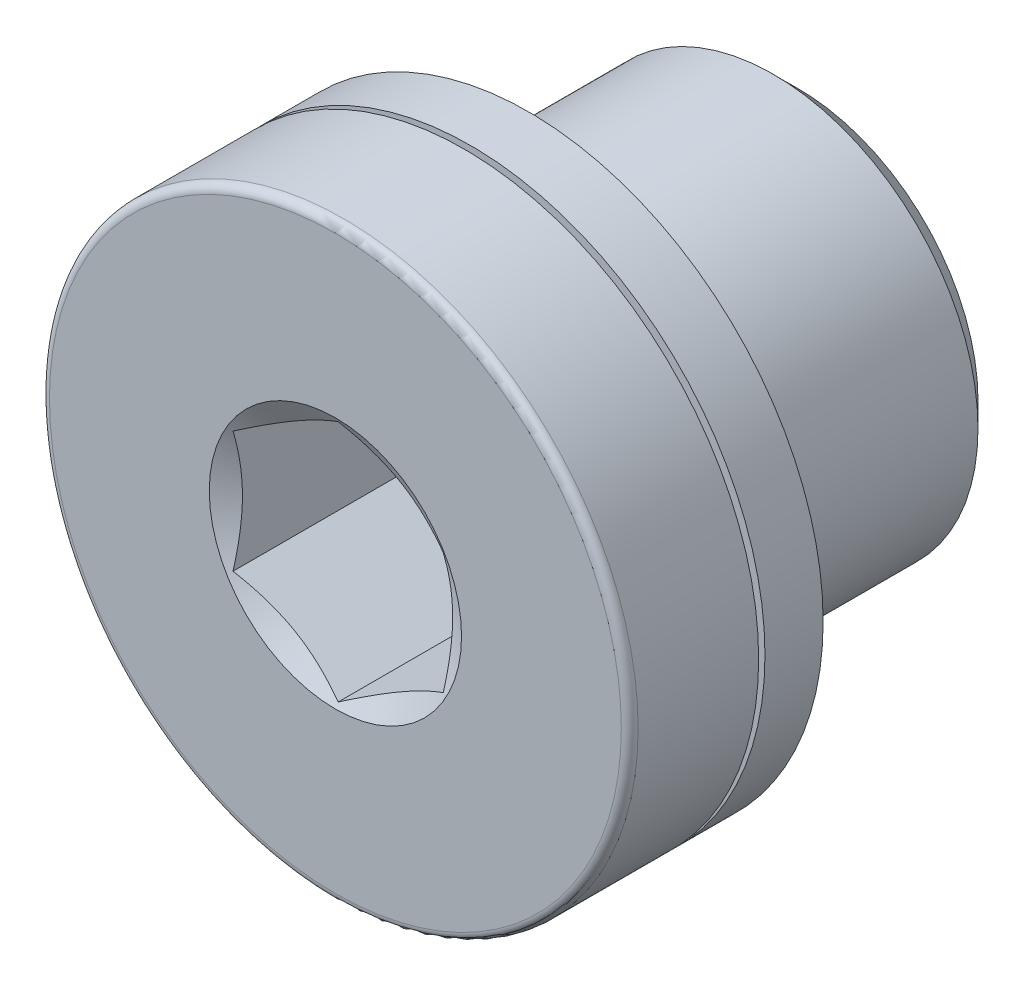
ISO-10303-21;
HEADER;
FILE_DESCRIPTION(('STEP AP214'),'2;1');
FILE_NAME('part.step','',(''),(''),'','','');
FILE_SCHEMA(('AUTOMOTIVE_DESIGN { 1 0 10303 214 1 1 1 1 }'));
ENDSEC;
DATA;
#1=APPLICATION_CONTEXT('core data for automotive mechanical design processes');
#2=APPLICATION_PROTOCOL_DEFINITION('international standard','automotive_design',2000,#1);
#3=PRODUCT_CONTEXT('',#1,'mechanical');
#4=PRODUCT('Part','Part','',(#3));
#5=PRODUCT_RELATED_PRODUCT_CATEGORY('part','',(#4));
#6=PRODUCT_DEFINITION_FORMATION('','',#4);
#7=PRODUCT_DEFINITION_CONTEXT('part definition',#1,'design');
#8=PRODUCT_DEFINITION('design','',#6,#7);
#9=PRODUCT_DEFINITION_SHAPE('','',#8);
#10=(LENGTH_UNIT() NAMED_UNIT(*) SI_UNIT(.MILLI.,.METRE.));
#11=(NAMED_UNIT(*) PLANE_ANGLE_UNIT() SI_UNIT($,.RADIAN.));
#12=(NAMED_UNIT(*) SI_UNIT($,.STERADIAN.) SOLID_ANGLE_UNIT());
#13=UNCERTAINTY_MEASURE_WITH_UNIT(LENGTH_MEASURE(1.E-05),#10,'distance_accuracy_value','');
#14=(GEOMETRIC_REPRESENTATION_CONTEXT(3) GLOBAL_UNCERTAINTY_ASSIGNED_CONTEXT((#13)) GLOBAL_UNIT_ASSIGNED_CONTEXT((#10,
#11,#12)) REPRESENTATION_CONTEXT('',''));
#15=CARTESIAN_POINT('',(0.,0.,0.));
#16=DIRECTION('',(0.,0.,1.));
#17=DIRECTION('',(1.,0.,0.));
#18=AXIS2_PLACEMENT_3D('',#15,#16,#17);
#19=CARTESIAN_POINT('',(0.,0.,4.6));
#20=DIRECTION('',(0.,0.,1.));
#21=DIRECTION('',(1.,0.,0.));
#22=AXIS2_PLACEMENT_3D('',#19,#20,#21);
#23=CONICAL_SURFACE('',#22,3.,1.04719755119659);
#24=CARTESIAN_POINT('',(0.0002,-2.88686681600194,4.53468252976428));
#25=CARTESIAN_POINT('',(-0.109663234734872,-2.82343724785372,4.4980464855128));
#26=CARTESIAN_POINT('',(-0.220474799896527,-2.75946016087832,4.46472708437023));
#27=CARTESIAN_POINT('',(-0.444016833466053,-2.63039810762176,4.40656715096303));
#28=CARTESIAN_POINT('',(-0.556751274528392,-2.56531084772748,4.38174719455291));
#29=CARTESIAN_POINT('',(-0.780822993875274,-2.43594298024478,4.34311051684623));
#30=CARTESIAN_POINT('',(-0.892125791767382,-2.37168227992022,4.32903666159082));
#31=CARTESIAN_POINT('',(-1.11525522746834,-2.24285844015414,4.31223401775793));
#32=CARTESIAN_POINT('',(-1.22708105401423,-2.17829576909552,4.30949131660881));
#33=CARTESIAN_POINT('',(-1.43604197555153,-2.05765212479586,4.31519062541324));
#34=CARTESIAN_POINT('',(-1.53320831755774,-2.00155311108241,4.32223325978705));
#35=CARTESIAN_POINT('',(-1.72690794971101,-1.88972057631679,4.34455628453013));
#36=CARTESIAN_POINT('',(-1.82344056965974,-1.83398744220381,4.35984430384546));
#37=CARTESIAN_POINT('',(-2.01753972174048,-1.72192424450052,4.39806395924961));
#38=CARTESIAN_POINT('',(-2.11508168178214,-1.66560836761319,4.42115764153071));
#39=CARTESIAN_POINT('',(-2.30871060807609,-1.55381665489449,4.47357152198311));
#40=CARTESIAN_POINT('',(-2.40480005588618,-1.49833938633505,4.50287940102974));
#41=CARTESIAN_POINT('',(-2.5002,-1.44326020292026,4.5346825297643));
#42=B_SPLINE_CURVE_WITH_KNOTS('',3,(#24,#25,#26,#27,#28,#29,#30,#31,#32,#33,#34,#35,#36,#37,#38,
#39,#40,#41),.UNSPECIFIED.,.F.,.F.,(4,2,2,2,2,2,2,2,4),(0.,0.396285827362224,0.793524330152046,
1.18093086852113,1.56786160134474,1.90479741793731,2.24204551660461,2.58677531536753,
2.93082800105253),.UNSPECIFIED.);
#43=CARTESIAN_POINT('',(0.,-2.8867513459481,4.53461585909777));
#44=VERTEX_POINT('',#43);
#45=CARTESIAN_POINT('',(-2.5,-1.4433756729741,4.5346158590978));
#46=VERTEX_POINT('',#45);
#47=EDGE_CURVE('E168',#44,#46,#42,.T.);
#48=ORIENTED_EDGE('',*,*,#47,.T.);
#49=CARTESIAN_POINT('',(-2.5,-3.75749145788339,5.47363157625222));
#50=CARTESIAN_POINT('',(-2.5,-3.64919841186996,5.42159269845017));
#51=CARTESIAN_POINT('',(-2.5,-3.54064339466357,5.37008890891806));
#52=CARTESIAN_POINT('',(-2.5,-3.3228694949907,5.26845533167727));
#53=CARTESIAN_POINT('',(-2.5,-3.21365049870229,5.21832578815435));
#54=CARTESIAN_POINT('',(-2.5,-2.99378661171534,5.11946624529765));
#55=CARTESIAN_POINT('',(-2.5,-2.88313709481265,5.07074649627705));
#56=CARTESIAN_POINT('',(-2.5,-2.66091438011002,4.97546923020821));
#57=CARTESIAN_POINT('',(-2.5,-2.54934123033597,4.9289116015586));
#58=CARTESIAN_POINT('',(-2.5,-2.32208129336724,4.83731979627917));
#59=CARTESIAN_POINT('',(-2.5,-2.20636439775533,4.79235988936502));
#60=CARTESIAN_POINT('',(-2.5,-1.97353370620353,4.70614167940336));
#61=CARTESIAN_POINT('',(-2.5,-1.85641974950128,4.66488380710281));
#62=CARTESIAN_POINT('',(-2.5,-1.62086916254349,4.5872406855576));
#63=CARTESIAN_POINT('',(-2.5,-1.50243619221283,4.55084445195485));
#64=CARTESIAN_POINT('',(-2.5,-1.26387801933199,4.48416968869073));
#65=CARTESIAN_POINT('',(-2.5,-1.14375340016755,4.45388910268924));
#66=CARTESIAN_POINT('',(-2.5,-0.902338315588339,4.40111657414383));
#67=CARTESIAN_POINT('',(-2.5,-0.781055515817549,4.37859024001396));
#68=CARTESIAN_POINT('',(-2.5,-0.537116621073338,4.3426935344368));
#69=CARTESIAN_POINT('',(-2.5,-0.414460624499676,4.32932251115766));
#70=CARTESIAN_POINT('',(-2.5,-0.169933632509077,4.31297766586888));
#71=CARTESIAN_POINT('',(-2.5,-0.0480711310514733,4.30987983675657));
#72=CARTESIAN_POINT('',(-2.5,0.195485912370085,4.31402426820572));
#73=CARTESIAN_POINT('',(-2.5,0.317180443894922,4.32126714481277));
#74=CARTESIAN_POINT('',(-2.5,0.527456408460873,4.34222611926243));
#75=CARTESIAN_POINT('',(-2.5,0.616270494320809,4.35371939209446));
#76=CARTESIAN_POINT('',(-2.5,0.793165661114637,4.38142947009885));
#77=CARTESIAN_POINT('',(-2.5,0.881246624045095,4.39764702112567));
#78=CARTESIAN_POINT('',(-2.5,1.14430390620604,4.45252703656414));
#79=CARTESIAN_POINT('',(-2.5,1.31798441198842,4.49740451996552));
#80=CARTESIAN_POINT('',(-2.5,1.66560393932168,4.60012958744614));
#81=CARTESIAN_POINT('',(-2.5,1.83945995346305,4.65824757701734));
#82=CARTESIAN_POINT('',(-2.5,2.09786165668661,4.75179017857617));
#83=CARTESIAN_POINT('',(-2.5,2.1835867516938,4.78402705771562));
#84=CARTESIAN_POINT('',(-2.5,2.35434488597652,4.85028226615287));
#85=CARTESIAN_POINT('',(-2.5,2.43937793702382,4.88430056507499));
#86=CARTESIAN_POINT('',(-2.5,2.65783078845747,4.97390856047049));
#87=CARTESIAN_POINT('',(-2.5,2.79079865565841,5.03059753836762));
#88=CARTESIAN_POINT('',(-2.5,3.05552029816646,5.14675125941288));
#89=CARTESIAN_POINT('',(-2.5,3.1872739810192,5.20621621188097));
#90=CARTESIAN_POINT('',(-2.5,3.44982928957636,5.32729059884971));
#91=CARTESIAN_POINT('',(-2.5,3.58063066968332,5.38890056440082));
#92=CARTESIAN_POINT('',(-2.5,3.84143730899347,5.5137857678841));
#93=CARTESIAN_POINT('',(-2.5,3.97144255002224,5.5770610436589));
#94=CARTESIAN_POINT('',(-2.5,4.36080606086041,5.76899660590649));
#95=CARTESIAN_POINT('',(-2.5,4.61919627366509,5.89961875475503));
#96=CARTESIAN_POINT('',(-2.5,5.13419069594109,6.16422182703926));
#97=CARTESIAN_POINT('',(-2.5,5.39079516582663,6.29820224704552));
#98=CARTESIAN_POINT('',(-2.5,5.87829290022415,6.55556666858143));
#99=CARTESIAN_POINT('',(-2.5,6.1092982352758,6.67873872928103));
#100=CARTESIAN_POINT('',(-2.5,6.57056638334677,6.92648759696893));
#101=CARTESIAN_POINT('',(-2.5,6.80082916311344,7.05106446577326));
#102=CARTESIAN_POINT('',(-2.5,7.26018235402638,7.30094373247041));
#103=CARTESIAN_POINT('',(-2.5,7.48927425655952,7.42624339179654));
#104=CARTESIAN_POINT('',(-2.5,7.94699348534722,7.67765659040072));
#105=CARTESIAN_POINT('',(-2.5,8.17562083840484,7.80377008086275));
#106=CARTESIAN_POINT('',(-2.5,8.40408211674829,7.9301817771395));
#107=B_SPLINE_CURVE_WITH_KNOTS('',3,(#49,#50,#51,#52,#53,#54,#55,#56,#57,#58,#59,#60,#61,#62,
#63,#64,#65,#66,#67,#68,#69,#70,#71,#72,#73,#74,#75,#76,#77,#78,#79,#80,#81,#82,#83,#84,#85,#86,
#87,#88,#89,#90,#91,#92,#93,#94,#95,#96,#97,#98,#99,#100,#101,#102,#103,#104,#105,#106),
.UNSPECIFIED.,.F.,.F.,(4,2,2,2,2,2,2,2,2,2,2,2,2,2,2,2,2,2,2,2,2,2,2,2,2,2,2,2,4),(0.,
0.360447630530675,0.720958898184671,1.08364194495586,1.44630625039165,1.81869010813538,
2.19111723824031,2.56268813752938,2.9341338901541,3.30391031762943,3.6736604153465,
4.03893071469015,4.40422277585142,4.67275529434614,4.94133023092329,5.47881127867105,
6.02844936287521,6.30319201919184,6.57792999229022,7.01152864941954,7.44516005465796,
7.87889959021416,8.31264899062128,9.18119380548513,10.0496091887469,10.8349772920855,
11.6203800900341,12.4037350961383,13.1870435431149),.UNSPECIFIED.);
#108=CARTESIAN_POINT('',(-2.5,1.4433756729741,4.5346158590978));
#109=VERTEX_POINT('',#108);
#110=EDGE_CURVE('E11',#46,#109,#107,.T.);
#111=ORIENTED_EDGE('',*,*,#110,.T.);
#112=CARTESIAN_POINT('',(-2.5002,1.44326020292026,4.5346825297643));
#113=CARTESIAN_POINT('',(-2.39033676526513,1.50668977106848,4.49804648551282));
#114=CARTESIAN_POINT('',(-2.27952520010347,1.57066685804388,4.46472708437025));
#115=CARTESIAN_POINT('',(-2.05598316653394,1.69972891130044,4.40656715096305));
#116=CARTESIAN_POINT('',(-1.9432487254716,1.76481617119472,4.38174719455293));
#117=CARTESIAN_POINT('',(-1.71917700612472,1.89418403867742,4.34311051684624));
#118=CARTESIAN_POINT('',(-1.60787420823261,1.95844473900199,4.32903666159083));
#119=CARTESIAN_POINT('',(-1.38474477253165,2.08726857876806,4.31223401775793));
#120=CARTESIAN_POINT('',(-1.27291894598575,2.15183124982668,4.30949131660881));
#121=CARTESIAN_POINT('',(-1.06395802444846,2.27247489412635,4.31519062541324));
#122=CARTESIAN_POINT('',(-0.966791682442249,2.3285739078398,4.32223325978704));
#123=CARTESIAN_POINT('',(-0.773092050288982,2.44040644260542,4.34455628453012));
#124=CARTESIAN_POINT('',(-0.676559430340254,2.49613957671839,4.35984430384545));
#125=CARTESIAN_POINT('',(-0.482460278259514,2.60820277442168,4.3980639592496));
#126=CARTESIAN_POINT('',(-0.384918318217852,2.66451865130901,4.42115764153069));
#127=CARTESIAN_POINT('',(-0.191289391923912,2.77631036402771,4.47357152198309));
#128=CARTESIAN_POINT('',(-0.0951999441138225,2.83178763258715,4.50287940102972));
#129=CARTESIAN_POINT('',(0.000199999999999802,2.88686681600194,4.53468252976428));
#130=B_SPLINE_CURVE_WITH_KNOTS('',3,(#112,#113,#114,#115,#116,#117,#118,#119,#120,#121,#122,
#123,#124,#125,#126,#127,#128,#129),.UNSPECIFIED.,.F.,.F.,(4,2,2,2,2,2,2,2,4),(0.,
0.39628582736223,0.793524330152058,1.18093086852115,1.56786160134477,1.90479741793733,
2.24204551660462,2.58677531536754,2.93082800105253),.UNSPECIFIED.);
#131=CARTESIAN_POINT('',(0.,2.8867513459481,4.53461585909777));
#132=VERTEX_POINT('',#131);
#133=EDGE_CURVE('E48',#109,#132,#130,.T.);
#134=ORIENTED_EDGE('',*,*,#133,.T.);
#135=CARTESIAN_POINT('',(-0.0002,2.88686681600194,4.53468252976428));
#136=CARTESIAN_POINT('',(0.109663234734872,2.82343724785372,4.4980464855128));
#137=CARTESIAN_POINT('',(0.220474799896527,2.75946016087832,4.46472708437023));
#138=CARTESIAN_POINT('',(0.444016833466053,2.63039810762176,4.40656715096303));
#139=CARTESIAN_POINT('',(0.556751274528392,2.56531084772748,4.38174719455291));
#140=CARTESIAN_POINT('',(0.780822993875274,2.43594298024478,4.34311051684623));
#141=CARTESIAN_POINT('',(0.892125791767382,2.37168227992022,4.32903666159082));
#142=CARTESIAN_POINT('',(1.11525522746834,2.24285844015414,4.31223401775793));
#143=CARTESIAN_POINT('',(1.22708105401423,2.17829576909552,4.30949131660881));
#144=CARTESIAN_POINT('',(1.43604197555153,2.05765212479586,4.31519062541324));
#145=CARTESIAN_POINT('',(1.53320831755774,2.00155311108241,4.32223325978705));
#146=CARTESIAN_POINT('',(1.72690794971101,1.88972057631679,4.34455628453013));
#147=CARTESIAN_POINT('',(1.82344056965974,1.83398744220381,4.35984430384546));
#148=CARTESIAN_POINT('',(2.01753972174048,1.72192424450052,4.39806395924961));
#149=CARTESIAN_POINT('',(2.11508168178214,1.66560836761319,4.42115764153071));
#150=CARTESIAN_POINT('',(2.30871060807609,1.55381665489449,4.47357152198311));
#151=CARTESIAN_POINT('',(2.40480005588618,1.49833938633505,4.50287940102974));
#152=CARTESIAN_POINT('',(2.5002,1.44326020292026,4.5346825297643));
#153=B_SPLINE_CURVE_WITH_KNOTS('',3,(#135,#136,#137,#138,#139,#140,#141,#142,#143,#144,#145,
#146,#147,#148,#149,#150,#151,#152),.UNSPECIFIED.,.F.,.F.,(4,2,2,2,2,2,2,2,4),(0.,
0.396285827362224,0.793524330152046,1.18093086852113,1.56786160134474,1.90479741793731,
2.24204551660461,2.58677531536753,2.93082800105253),.UNSPECIFIED.);
#154=CARTESIAN_POINT('',(2.5,1.4433756729741,4.5346158590978));
#155=VERTEX_POINT('',#154);
#156=EDGE_CURVE('E276',#132,#155,#153,.T.);
#157=ORIENTED_EDGE('',*,*,#156,.T.);
#158=CARTESIAN_POINT('',(2.5,-3.75749145788339,5.47363157625222));
#159=CARTESIAN_POINT('',(2.5,-3.64919841186996,5.42159269845017));
#160=CARTESIAN_POINT('',(2.5,-3.54064339466357,5.37008890891806));
#161=CARTESIAN_POINT('',(2.5,-3.3228694949907,5.26845533167727));
#162=CARTESIAN_POINT('',(2.5,-3.21365049870229,5.21832578815435));
#163=CARTESIAN_POINT('',(2.5,-2.99378661171534,5.11946624529765));
#164=CARTESIAN_POINT('',(2.5,-2.88313709481265,5.07074649627705));
#165=CARTESIAN_POINT('',(2.5,-2.66091438011002,4.97546923020821));
#166=CARTESIAN_POINT('',(2.5,-2.54934123033597,4.9289116015586));
#167=CARTESIAN_POINT('',(2.5,-2.32208129336724,4.83731979627917));
#168=CARTESIAN_POINT('',(2.5,-2.20636439775533,4.79235988936502));
#169=CARTESIAN_POINT('',(2.5,-1.97353370620353,4.70614167940336));
#170=CARTESIAN_POINT('',(2.5,-1.85641974950128,4.66488380710281));
#171=CARTESIAN_POINT('',(2.5,-1.62086916254349,4.5872406855576));
#172=CARTESIAN_POINT('',(2.5,-1.50243619221283,4.55084445195485));
#173=CARTESIAN_POINT('',(2.5,-1.26387801933199,4.48416968869073));
#174=CARTESIAN_POINT('',(2.5,-1.14375340016755,4.45388910268924));
#175=CARTESIAN_POINT('',(2.5,-0.902338315588339,4.40111657414383));
#176=CARTESIAN_POINT('',(2.5,-0.781055515817549,4.37859024001396));
#177=CARTESIAN_POINT('',(2.5,-0.537116621073338,4.3426935344368));
#178=CARTESIAN_POINT('',(2.5,-0.414460624499676,4.32932251115766));
#179=CARTESIAN_POINT('',(2.5,-0.169933632509077,4.31297766586888));
#180=CARTESIAN_POINT('',(2.5,-0.0480711310514733,4.30987983675657));
#181=CARTESIAN_POINT('',(2.5,0.195485912370085,4.31402426820572));
#182=CARTESIAN_POINT('',(2.5,0.317180443894922,4.32126714481277));
#183=CARTESIAN_POINT('',(2.5,0.527456408460873,4.34222611926243));
#184=CARTESIAN_POINT('',(2.5,0.616270494320809,4.35371939209446));
#185=CARTESIAN_POINT('',(2.5,0.793165661114637,4.38142947009885));
#186=CARTESIAN_POINT('',(2.5,0.881246624045095,4.39764702112567));
#187=CARTESIAN_POINT('',(2.5,1.14430390620604,4.45252703656414));
#188=CARTESIAN_POINT('',(2.5,1.31798441198842,4.49740451996552));
#189=CARTESIAN_POINT('',(2.5,1.66560393932168,4.60012958744614));
#190=CARTESIAN_POINT('',(2.5,1.83945995346305,4.65824757701734));
#191=CARTESIAN_POINT('',(2.5,2.09786165668661,4.75179017857617));
#192=CARTESIAN_POINT('',(2.5,2.1835867516938,4.78402705771562));
#193=CARTESIAN_POINT('',(2.5,2.35434488597652,4.85028226615287));
#194=CARTESIAN_POINT('',(2.5,2.43937793702382,4.88430056507499));
#195=CARTESIAN_POINT('',(2.5,2.65783078845747,4.97390856047049));
#196=CARTESIAN_POINT('',(2.5,2.79079865565841,5.03059753836762));
#197=CARTESIAN_POINT('',(2.5,3.05552029816646,5.14675125941288));
#198=CARTESIAN_POINT('',(2.5,3.1872739810192,5.20621621188097));
#199=CARTESIAN_POINT('',(2.5,3.44982928957636,5.32729059884971));
#200=CARTESIAN_POINT('',(2.5,3.58063066968332,5.38890056440082));
#201=CARTESIAN_POINT('',(2.5,3.84143730899347,5.5137857678841));
#202=CARTESIAN_POINT('',(2.5,3.97144255002224,5.5770610436589));
#203=CARTESIAN_POINT('',(2.5,4.36080606086041,5.76899660590649));
#204=CARTESIAN_POINT('',(2.5,4.61919627366509,5.89961875475503));
#205=CARTESIAN_POINT('',(2.5,5.13419069594109,6.16422182703926));
#206=CARTESIAN_POINT('',(2.5,5.39079516582663,6.29820224704552));
#207=CARTESIAN_POINT('',(2.5,5.87829290022415,6.55556666858143));
#208=CARTESIAN_POINT('',(2.5,6.1092982352758,6.67873872928103));
#209=CARTESIAN_POINT('',(2.5,6.57056638334677,6.92648759696893));
#210=CARTESIAN_POINT('',(2.5,6.80082916311344,7.05106446577326));
#211=CARTESIAN_POINT('',(2.5,7.26018235402638,7.30094373247041));
#212=CARTESIAN_POINT('',(2.5,7.48927425655952,7.42624339179654));
#213=CARTESIAN_POINT('',(2.5,7.94699348534722,7.67765659040072));
#214=CARTESIAN_POINT('',(2.5,8.17562083840484,7.80377008086275));
#215=CARTESIAN_POINT('',(2.5,8.40408211674829,7.9301817771395));
#216=B_SPLINE_CURVE_WITH_KNOTS('',3,(#158,#159,#160,#161,#162,#163,#164,#165,#166,#167,#168,
#169,#170,#171,#172,#173,#174,#175,#176,#177,#178,#179,#180,#181,#182,#183,#184,#185,#186,#187,
#188,#189,#190,#191,#192,#193,#194,#195,#196,#197,#198,#199,#200,#201,#202,#203,#204,#205,#206,
#207,#208,#209,#210,#211,#212,#213,#214,#215),.UNSPECIFIED.,.F.,.F.,(4,2,2,2,2,2,2,2,2,2,2,2,2,
2,2,2,2,2,2,2,2,2,2,2,2,2,2,2,4),(0.,0.360447630530675,0.720958898184671,1.08364194495586,
1.44630625039165,1.81869010813538,2.19111723824031,2.56268813752938,2.9341338901541,
3.30391031762943,3.6736604153465,4.03893071469015,4.40422277585142,4.67275529434614,
4.94133023092329,5.47881127867105,6.02844936287521,6.30319201919184,6.57792999229022,
7.01152864941954,7.44516005465796,7.87889959021416,8.31264899062128,9.18119380548513,
10.0496091887469,10.8349772920855,11.6203800900341,12.4037350961383,13.1870435431149),.UNSPECIFIED.);
#217=CARTESIAN_POINT('',(2.5,-1.4433756729741,4.5346158590978));
#218=VERTEX_POINT('',#217);
#219=EDGE_CURVE('E272',#155,#218,#216,.F.);
#220=ORIENTED_EDGE('',*,*,#219,.T.);
#221=CARTESIAN_POINT('',(2.5002,-1.44326020292026,4.5346825297643));
#222=CARTESIAN_POINT('',(2.39033676526513,-1.50668977106848,4.49804648551282));
#223=CARTESIAN_POINT('',(2.27952520010347,-1.57066685804388,4.46472708437025));
#224=CARTESIAN_POINT('',(2.05598316653394,-1.69972891130044,4.40656715096305));
#225=CARTESIAN_POINT('',(1.9432487254716,-1.76481617119472,4.38174719455293));
#226=CARTESIAN_POINT('',(1.71917700612472,-1.89418403867742,4.34311051684624));
#227=CARTESIAN_POINT('',(1.60787420823261,-1.95844473900199,4.32903666159083));
#228=CARTESIAN_POINT('',(1.38474477253165,-2.08726857876806,4.31223401775793));
#229=CARTESIAN_POINT('',(1.27291894598575,-2.15183124982668,4.30949131660881));
#230=CARTESIAN_POINT('',(1.06395802444846,-2.27247489412635,4.31519062541324));
#231=CARTESIAN_POINT('',(0.966791682442249,-2.3285739078398,4.32223325978704));
#232=CARTESIAN_POINT('',(0.773092050288982,-2.44040644260542,4.34455628453012));
#233=CARTESIAN_POINT('',(0.676559430340254,-2.49613957671839,4.35984430384545));
#234=CARTESIAN_POINT('',(0.482460278259514,-2.60820277442168,4.3980639592496));
#235=CARTESIAN_POINT('',(0.384918318217852,-2.66451865130901,4.42115764153069));
#236=CARTESIAN_POINT('',(0.191289391923912,-2.77631036402771,4.47357152198309));
#237=CARTESIAN_POINT('',(0.0951999441138225,-2.83178763258715,4.50287940102972));
#238=CARTESIAN_POINT('',(-0.000199999999999802,-2.88686681600194,4.53468252976428));
#239=B_SPLINE_CURVE_WITH_KNOTS('',3,(#221,#222,#223,#224,#225,#226,#227,#228,#229,#230,#231,
#232,#233,#234,#235,#236,#237,#238),.UNSPECIFIED.,.F.,.F.,(4,2,2,2,2,2,2,2,4),(0.,
0.39628582736223,0.793524330152058,1.18093086852115,1.56786160134477,1.90479741793733,
2.24204551660462,2.58677531536754,2.93082800105253),.UNSPECIFIED.);
#240=EDGE_CURVE('E174',#218,#44,#239,.T.);
#241=ORIENTED_EDGE('',*,*,#240,.T.);
#242=EDGE_LOOP('',(#48,#111,#134,#157,#220,#241));
#243=FACE_BOUND('',#242,.T.);
#244=CARTESIAN_POINT('',(0.,0.,4.6));
#245=DIRECTION('',(0.,0.,1.));
#246=DIRECTION('',(1.,0.,0.));
#247=AXIS2_PLACEMENT_3D('',#244,#245,#246);
#248=CIRCLE('',#247,3.);
#249=CARTESIAN_POINT('',(3.,0.,4.6));
#250=VERTEX_POINT('',#249);
#251=EDGE_CURVE('E165',#250,#250,#248,.T.);
#252=ORIENTED_EDGE('',*,*,#251,.T.);
#253=EDGE_LOOP('',(#252));
#254=FACE_BOUND('',#253,.T.);
#255=ADVANCED_FACE('F36',(#243,#254),#23,.F.);
#256=CARTESIAN_POINT('',(0.,3.,4.6));
#257=DIRECTION('',(0.,0.,-1.));
#258=DIRECTION('',(-1.,0.,0.));
#259=AXIS2_PLACEMENT_3D('',#256,#257,#258);
#260=PLANE('',#259);
#261=ORIENTED_EDGE('',*,*,#251,.F.);
#262=EDGE_LOOP('',(#261));
#263=FACE_BOUND('',#262,.T.);
#264=CARTESIAN_POINT('',(0.,0.,4.6));
#265=DIRECTION('',(0.,0.,1.));
#266=DIRECTION('',(1.,0.,0.));
#267=AXIS2_PLACEMENT_3D('',#264,#265,#266);
#268=CIRCLE('',#267,6.8);
#269=CARTESIAN_POINT('',(6.8,0.,4.6));
#270=VERTEX_POINT('',#269);
#271=EDGE_CURVE('E162',#270,#270,#268,.T.);
#272=ORIENTED_EDGE('',*,*,#271,.T.);
#273=EDGE_LOOP('',(#272));
#274=FACE_BOUND('',#273,.T.);
#275=ADVANCED_FACE('F231',(#263,#274),#260,.F.);
#276=CARTESIAN_POINT('',(0.,0.,4.39999999999997));
#277=DIRECTION('',(0.,0.,1.));
#278=DIRECTION('',(1.,0.,0.));
#279=AXIS2_PLACEMENT_3D('',#276,#277,#278);
#280=TOROIDAL_SURFACE('',#279,6.79999999999997,0.200000000000033);
#281=ORIENTED_EDGE('',*,*,#271,.F.);
#282=EDGE_LOOP('',(#281));
#283=FACE_BOUND('',#282,.T.);
#284=CARTESIAN_POINT('',(0.,0.,4.4));
#285=DIRECTION('',(0.,0.,1.));
#286=DIRECTION('',(1.,0.,0.));
#287=AXIS2_PLACEMENT_3D('',#284,#285,#286);
#288=CIRCLE('',#287,7.);
#289=CARTESIAN_POINT('',(7.,0.,4.4));
#290=VERTEX_POINT('',#289);
#291=EDGE_CURVE('E159',#290,#290,#288,.T.);
#292=ORIENTED_EDGE('',*,*,#291,.T.);
#293=EDGE_LOOP('',(#292));
#294=FACE_BOUND('',#293,.T.);
#295=ADVANCED_FACE('F228',(#283,#294),#280,.T.);
#296=CARTESIAN_POINT('',(0.,0.,-6.4));
#297=DIRECTION('',(0.,0.,1.));
#298=DIRECTION('',(1.,0.,0.));
#299=AXIS2_PLACEMENT_3D('',#296,#297,#298);
#300=CYLINDRICAL_SURFACE('',#299,7.);
#301=ORIENTED_EDGE('',*,*,#291,.F.);
#302=EDGE_LOOP('',(#301));
#303=FACE_BOUND('',#302,.T.);
#304=CARTESIAN_POINT('',(0.,0.,1.5333333333333));
#305=DIRECTION('',(0.,0.,1.));
#306=DIRECTION('',(1.,0.,0.));
#307=AXIS2_PLACEMENT_3D('',#304,#305,#306);
#308=CIRCLE('',#307,7.);
#309=CARTESIAN_POINT('',(7.,0.,1.5333333333333));
#310=VERTEX_POINT('',#309);
#311=EDGE_CURVE('E156',#310,#310,#308,.T.);
#312=ORIENTED_EDGE('',*,*,#311,.T.);
#313=EDGE_LOOP('',(#312));
#314=FACE_BOUND('',#313,.T.);
#315=ADVANCED_FACE('F224',(#303,#314),#300,.T.);
#316=CARTESIAN_POINT('',(0.,7.,1.5333333333333));
#317=DIRECTION('',(0.,0.,1.));
#318=DIRECTION('',(1.,0.,0.));
#319=AXIS2_PLACEMENT_3D('',#316,#317,#318);
#320=PLANE('',#319);
#321=ORIENTED_EDGE('',*,*,#311,.F.);
#322=EDGE_LOOP('',(#321));
#323=FACE_BOUND('',#322,.T.);
#324=CARTESIAN_POINT('',(0.,0.,1.5333333333333));
#325=DIRECTION('',(0.,0.,1.));
#326=DIRECTION('',(1.,0.,0.));
#327=AXIS2_PLACEMENT_3D('',#324,#325,#326);
#328=CIRCLE('',#327,6.3);
#329=CARTESIAN_POINT('',(6.3,0.,1.5333333333333));
#330=VERTEX_POINT('',#329);
#331=EDGE_CURVE('E153',#330,#330,#328,.T.);
#332=ORIENTED_EDGE('',*,*,#331,.T.);
#333=EDGE_LOOP('',(#332));
#334=FACE_BOUND('',#333,.T.);
#335=ADVANCED_FACE('F220',(#323,#334),#320,.F.);
#336=CARTESIAN_POINT('',(0.,0.,-6.4));
#337=DIRECTION('',(0.,0.,1.));
#338=DIRECTION('',(1.,0.,0.));
#339=AXIS2_PLACEMENT_3D('',#336,#337,#338);
#340=CYLINDRICAL_SURFACE('',#339,6.3);
#341=ORIENTED_EDGE('',*,*,#331,.F.);
#342=EDGE_LOOP('',(#341));
#343=FACE_BOUND('',#342,.T.);
#344=CARTESIAN_POINT('',(0.,0.,1.3833333333333));
#345=DIRECTION('',(0.,0.,1.));
#346=DIRECTION('',(1.,0.,0.));
#347=AXIS2_PLACEMENT_3D('',#344,#345,#346);
#348=CIRCLE('',#347,6.3);
#349=CARTESIAN_POINT('',(6.3,0.,1.3833333333333));
#350=VERTEX_POINT('',#349);
#351=EDGE_CURVE('E150',#350,#350,#348,.T.);
#352=ORIENTED_EDGE('',*,*,#351,.T.);
#353=EDGE_LOOP('',(#352));
#354=FACE_BOUND('',#353,.T.);
#355=ADVANCED_FACE('F216',(#343,#354),#340,.T.);
#356=CARTESIAN_POINT('',(0.,6.3,1.3833333333333));
#357=DIRECTION('',(0.,0.,-1.));
#358=DIRECTION('',(-1.,0.,0.));
#359=AXIS2_PLACEMENT_3D('',#356,#357,#358);
#360=PLANE('',#359);
#361=ORIENTED_EDGE('',*,*,#351,.F.);
#362=EDGE_LOOP('',(#361));
#363=FACE_BOUND('',#362,.T.);
#364=CARTESIAN_POINT('',(0.,0.,1.3833333333333));
#365=DIRECTION('',(0.,0.,1.));
#366=DIRECTION('',(1.,0.,0.));
#367=AXIS2_PLACEMENT_3D('',#364,#365,#366);
#368=CIRCLE('',#367,7.);
#369=CARTESIAN_POINT('',(7.,0.,1.3833333333333));
#370=VERTEX_POINT('',#369);
#371=EDGE_CURVE('E147',#370,#370,#368,.T.);
#372=ORIENTED_EDGE('',*,*,#371,.T.);
#373=EDGE_LOOP('',(#372));
#374=FACE_BOUND('',#373,.T.);
#375=ADVANCED_FACE('F212',(#363,#374),#360,.F.);
#376=CARTESIAN_POINT('',(0.,0.,-6.4));
#377=DIRECTION('',(0.,0.,1.));
#378=DIRECTION('',(1.,0.,0.));
#379=AXIS2_PLACEMENT_3D('',#376,#377,#378);
#380=CYLINDRICAL_SURFACE('',#379,7.);
#381=ORIENTED_EDGE('',*,*,#371,.F.);
#382=EDGE_LOOP('',(#381));
#383=FACE_BOUND('',#382,.T.);
#384=CARTESIAN_POINT('',(0.,0.,0.));
#385=DIRECTION('',(0.,0.,1.));
#386=DIRECTION('',(1.,0.,0.));
#387=AXIS2_PLACEMENT_3D('',#384,#385,#386);
#388=CIRCLE('',#387,7.);
#389=CARTESIAN_POINT('',(7.,0.,0.));
#390=VERTEX_POINT('',#389);
#391=EDGE_CURVE('E144',#390,#390,#388,.T.);
#392=ORIENTED_EDGE('',*,*,#391,.T.);
#393=EDGE_LOOP('',(#392));
#394=FACE_BOUND('',#393,.T.);
#395=ADVANCED_FACE('F208',(#383,#394),#380,.T.);
#396=CARTESIAN_POINT('',(0.,7.,0.));
#397=DIRECTION('',(0.,0.,1.));
#398=DIRECTION('',(1.,0.,0.));
#399=AXIS2_PLACEMENT_3D('',#396,#397,#398);
#400=PLANE('',#399);
#401=ORIENTED_EDGE('',*,*,#391,.F.);
#402=EDGE_LOOP('',(#401));
#403=FACE_BOUND('',#402,.T.);
#404=CARTESIAN_POINT('',(0.,0.,0.));
#405=DIRECTION('',(0.,0.,1.));
#406=DIRECTION('',(1.,0.,0.));
#407=AXIS2_PLACEMENT_3D('',#404,#405,#406);
#408=CIRCLE('',#407,4.283);
#409=CARTESIAN_POINT('',(4.283,0.,0.));
#410=VERTEX_POINT('',#409);
#411=EDGE_CURVE('E141',#410,#410,#408,.T.);
#412=ORIENTED_EDGE('',*,*,#411,.T.);
#413=EDGE_LOOP('',(#412));
#414=FACE_BOUND('',#413,.T.);
#415=ADVANCED_FACE('F204',(#403,#414),#400,.F.);
#416=CARTESIAN_POINT('',(0.,0.,-0.581));
#417=DIRECTION('',(0.,0.,-1.));
#418=DIRECTION('',(-1.,0.,0.));
#419=AXIS2_PLACEMENT_3D('',#416,#417,#418);
#420=CONICAL_SURFACE('',#419,4.864,0.785398163397448);
#421=ORIENTED_EDGE('',*,*,#411,.F.);
#422=EDGE_LOOP('',(#421));
#423=FACE_BOUND('',#422,.T.);
#424=CARTESIAN_POINT('',(0.,0.,-0.581));
#425=DIRECTION('',(0.,0.,1.));
#426=DIRECTION('',(1.,0.,0.));
#427=AXIS2_PLACEMENT_3D('',#424,#425,#426);
#428=CIRCLE('',#427,4.864);
#429=CARTESIAN_POINT('',(4.864,0.,-0.581));
#430=VERTEX_POINT('',#429);
#431=EDGE_CURVE('E138',#430,#430,#428,.T.);
#432=ORIENTED_EDGE('',*,*,#431,.T.);
#433=EDGE_LOOP('',(#432));
#434=FACE_BOUND('',#433,.T.);
#435=ADVANCED_FACE('F200',(#423,#434),#420,.T.);
#436=CARTESIAN_POINT('',(0.,0.,-6.4));
#437=DIRECTION('',(0.,0.,1.));
#438=DIRECTION('',(1.,0.,0.));
#439=AXIS2_PLACEMENT_3D('',#436,#437,#438);
#440=CYLINDRICAL_SURFACE('',#439,4.864);
#441=ORIENTED_EDGE('',*,*,#431,.F.);
#442=EDGE_LOOP('',(#441));
#443=FACE_BOUND('',#442,.T.);
#444=CARTESIAN_POINT('',(0.,0.,-5.819));
#445=DIRECTION('',(0.,0.,1.));
#446=DIRECTION('',(1.,0.,0.));
#447=AXIS2_PLACEMENT_3D('',#444,#445,#446);
#448=CIRCLE('',#447,4.864);
#449=CARTESIAN_POINT('',(4.864,0.,-5.819));
#450=VERTEX_POINT('',#449);
#451=EDGE_CURVE('E135',#450,#450,#448,.T.);
#452=ORIENTED_EDGE('',*,*,#451,.T.);
#453=EDGE_LOOP('',(#452));
#454=FACE_BOUND('',#453,.T.);
#455=ADVANCED_FACE('F196',(#443,#454),#440,.T.);
#456=CARTESIAN_POINT('',(0.,0.,-6.4));
#457=DIRECTION('',(0.,0.,1.));
#458=DIRECTION('',(1.,0.,0.));
#459=AXIS2_PLACEMENT_3D('',#456,#457,#458);
#460=CONICAL_SURFACE('',#459,4.283,0.785398163397448);
#461=ORIENTED_EDGE('',*,*,#451,.F.);
#462=EDGE_LOOP('',(#461));
#463=FACE_BOUND('',#462,.T.);
#464=CARTESIAN_POINT('',(0.,0.,-6.4));
#465=DIRECTION('',(0.,0.,1.));
#466=DIRECTION('',(1.,0.,0.));
#467=AXIS2_PLACEMENT_3D('',#464,#465,#466);
#468=CIRCLE('',#467,4.283);
#469=CARTESIAN_POINT('',(4.283,0.,-6.4));
#470=VERTEX_POINT('',#469);
#471=EDGE_CURVE('E123',#470,#470,#468,.T.);
#472=ORIENTED_EDGE('',*,*,#471,.T.);
#473=EDGE_LOOP('',(#472));
#474=FACE_BOUND('',#473,.T.);
#475=ADVANCED_FACE('F192',(#463,#474),#460,.T.);
#476=CARTESIAN_POINT('',(0.,4.283,-6.4));
#477=DIRECTION('',(0.,0.,1.));
#478=DIRECTION('',(1.,0.,0.));
#479=AXIS2_PLACEMENT_3D('',#476,#477,#478);
#480=PLANE('',#479);
#481=ORIENTED_EDGE('',*,*,#471,.F.);
#482=EDGE_LOOP('',(#481));
#483=FACE_BOUND('',#482,.T.);
#484=ADVANCED_FACE('F189',(#483),#480,.F.);
#485=CARTESIAN_POINT('',(-2.5,1.4433756729741,0.));
#486=DIRECTION('',(-1.,0.,0.));
#487=DIRECTION('',(0.,0.,1.));
#488=AXIS2_PLACEMENT_3D('',#485,#486,#487);
#489=PLANE('',#488);
#490=DIRECTION('',(0.,0.,1.));
#491=VECTOR('',#490,1.);
#492=CARTESIAN_POINT('',(-2.5,-1.4433756729741,0.));
#493=LINE('',#492,#491);
#494=CARTESIAN_POINT('',(-2.5,-1.4433756729741,0.));
#495=VERTEX_POINT('',#494);
#496=EDGE_CURVE('E55',#495,#46,#493,.T.);
#497=ORIENTED_EDGE('',*,*,#496,.F.);
#498=DIRECTION('',(0.,-1.,0.));
#499=VECTOR('',#498,1.);
#500=CARTESIAN_POINT('',(-2.5,1.4433756729741,0.));
#501=LINE('',#500,#499);
#502=CARTESIAN_POINT('',(-2.5,1.4433756729741,0.));
#503=VERTEX_POINT('',#502);
#504=EDGE_CURVE('E94',#503,#495,#501,.T.);
#505=ORIENTED_EDGE('',*,*,#504,.F.);
#506=DIRECTION('',(0.,0.,1.));
#507=VECTOR('',#506,1.);
#508=CARTESIAN_POINT('',(-2.5,1.4433756729741,0.));
#509=LINE('',#508,#507);
#510=EDGE_CURVE('E121',#503,#109,#509,.T.);
#511=ORIENTED_EDGE('',*,*,#510,.T.);
#512=ORIENTED_EDGE('',*,*,#110,.F.);
#513=EDGE_LOOP('',(#497,#505,#511,#512));
#514=FACE_BOUND('',#513,.T.);
#515=ADVANCED_FACE('F92',(#514),#489,.F.);
#516=CARTESIAN_POINT('',(0.,2.8867513459481,0.));
#517=DIRECTION('',(-0.499999999999983,0.866025403784448,0.));
#518=DIRECTION('',(-0.866025403784448,-0.499999999999983,0.));
#519=AXIS2_PLACEMENT_3D('',#516,#517,#518);
#520=PLANE('',#519);
#521=ORIENTED_EDGE('',*,*,#510,.F.);
#522=DIRECTION('',(-0.866025403784448,-0.499999999999983,0.));
#523=VECTOR('',#522,1.);
#524=CARTESIAN_POINT('',(0.,2.8867513459481,0.));
#525=LINE('',#524,#523);
#526=CARTESIAN_POINT('',(0.,2.8867513459481,0.));
#527=VERTEX_POINT('',#526);
#528=EDGE_CURVE('E98',#527,#503,#525,.T.);
#529=ORIENTED_EDGE('',*,*,#528,.F.);
#530=DIRECTION('',(0.,0.,1.));
#531=VECTOR('',#530,1.);
#532=CARTESIAN_POINT('',(0.,2.8867513459481,0.));
#533=LINE('',#532,#531);
#534=EDGE_CURVE('E124',#527,#132,#533,.T.);
#535=ORIENTED_EDGE('',*,*,#534,.T.);
#536=ORIENTED_EDGE('',*,*,#133,.F.);
#537=EDGE_LOOP('',(#521,#529,#535,#536));
#538=FACE_BOUND('',#537,.T.);
#539=ADVANCED_FACE('F188',(#538),#520,.F.);
#540=CARTESIAN_POINT('',(2.5,1.4433756729741,0.));
#541=DIRECTION('',(0.499999999999983,0.866025403784448,0.));
#542=DIRECTION('',(-0.866025403784448,0.499999999999983,0.));
#543=AXIS2_PLACEMENT_3D('',#540,#541,#542);
#544=PLANE('',#543);
#545=ORIENTED_EDGE('',*,*,#534,.F.);
#546=DIRECTION('',(-0.866025403784448,0.499999999999983,0.));
#547=VECTOR('',#546,1.);
#548=CARTESIAN_POINT('',(2.5,1.4433756729741,0.));
#549=LINE('',#548,#547);
#550=CARTESIAN_POINT('',(2.5,1.4433756729741,0.));
#551=VERTEX_POINT('',#550);
#552=EDGE_CURVE('E118',#551,#527,#549,.T.);
#553=ORIENTED_EDGE('',*,*,#552,.F.);
#554=DIRECTION('',(0.,0.,1.));
#555=VECTOR('',#554,1.);
#556=CARTESIAN_POINT('',(2.5,1.4433756729741,0.));
#557=LINE('',#556,#555);
#558=EDGE_CURVE('E126',#551,#155,#557,.T.);
#559=ORIENTED_EDGE('',*,*,#558,.T.);
#560=ORIENTED_EDGE('',*,*,#156,.F.);
#561=EDGE_LOOP('',(#545,#553,#559,#560));
#562=FACE_BOUND('',#561,.T.);
#563=ADVANCED_FACE('F275',(#562),#544,.F.);
#564=CARTESIAN_POINT('',(2.5,-1.4433756729741,0.));
#565=DIRECTION('',(1.,0.,0.));
#566=DIRECTION('',(0.,0.,-1.));
#567=AXIS2_PLACEMENT_3D('',#564,#565,#566);
#568=PLANE('',#567);
#569=ORIENTED_EDGE('',*,*,#558,.F.);
#570=DIRECTION('',(0.,1.,0.));
#571=VECTOR('',#570,1.);
#572=CARTESIAN_POINT('',(2.5,-1.4433756729741,0.));
#573=LINE('',#572,#571);
#574=CARTESIAN_POINT('',(2.5,-1.4433756729741,0.));
#575=VERTEX_POINT('',#574);
#576=EDGE_CURVE('E115',#575,#551,#573,.T.);
#577=ORIENTED_EDGE('',*,*,#576,.F.);
#578=DIRECTION('',(0.,0.,1.));
#579=VECTOR('',#578,1.);
#580=CARTESIAN_POINT('',(2.5,-1.4433756729741,0.));
#581=LINE('',#580,#579);
#582=EDGE_CURVE('E129',#575,#218,#581,.T.);
#583=ORIENTED_EDGE('',*,*,#582,.T.);
#584=ORIENTED_EDGE('',*,*,#219,.F.);
#585=EDGE_LOOP('',(#569,#577,#583,#584));
#586=FACE_BOUND('',#585,.T.);
#587=ADVANCED_FACE('F271',(#586),#568,.F.);
#588=CARTESIAN_POINT('',(0.,-2.8867513459481,0.));
#589=DIRECTION('',(0.499999999999983,-0.866025403784448,0.));
#590=DIRECTION('',(0.866025403784448,0.499999999999983,0.));
#591=AXIS2_PLACEMENT_3D('',#588,#589,#590);
#592=PLANE('',#591);
#593=ORIENTED_EDGE('',*,*,#582,.F.);
#594=DIRECTION('',(0.866025403784448,0.499999999999983,0.));
#595=VECTOR('',#594,1.);
#596=CARTESIAN_POINT('',(0.,-2.8867513459481,0.));
#597=LINE('',#596,#595);
#598=CARTESIAN_POINT('',(0.,-2.8867513459481,0.));
#599=VERTEX_POINT('',#598);
#600=EDGE_CURVE('E107',#599,#575,#597,.T.);
#601=ORIENTED_EDGE('',*,*,#600,.F.);
#602=DIRECTION('',(0.,0.,1.));
#603=VECTOR('',#602,1.);
#604=CARTESIAN_POINT('',(0.,-2.8867513459481,0.));
#605=LINE('',#604,#603);
#606=EDGE_CURVE('E97',#599,#44,#605,.T.);
#607=ORIENTED_EDGE('',*,*,#606,.T.);
#608=ORIENTED_EDGE('',*,*,#240,.F.);
#609=EDGE_LOOP('',(#593,#601,#607,#608));
#610=FACE_BOUND('',#609,.T.);
#611=ADVANCED_FACE('F182',(#610),#592,.F.);
#612=CARTESIAN_POINT('',(-2.5,-1.4433756729741,0.));
#613=DIRECTION('',(-0.499999999999983,-0.866025403784448,0.));
#614=DIRECTION('',(0.866025403784448,-0.499999999999983,0.));
#615=AXIS2_PLACEMENT_3D('',#612,#613,#614);
#616=PLANE('',#615);
#617=ORIENTED_EDGE('',*,*,#606,.F.);
#618=DIRECTION('',(0.866025403784448,-0.499999999999983,0.));
#619=VECTOR('',#618,1.);
#620=CARTESIAN_POINT('',(-2.5,-1.4433756729741,0.));
#621=LINE('',#620,#619);
#622=EDGE_CURVE('E101',#495,#599,#621,.T.);
#623=ORIENTED_EDGE('',*,*,#622,.F.);
#624=ORIENTED_EDGE('',*,*,#496,.T.);
#625=ORIENTED_EDGE('',*,*,#47,.F.);
#626=EDGE_LOOP('',(#617,#623,#624,#625));
#627=FACE_BOUND('',#626,.T.);
#628=ADVANCED_FACE('F102',(#627),#616,.F.);
#629=CARTESIAN_POINT('',(0.,0.,0.));
#630=DIRECTION('',(0.,0.,1.));
#631=DIRECTION('',(1.,0.,0.));
#632=AXIS2_PLACEMENT_3D('',#629,#630,#631);
#633=PLANE('',#632);
#634=ORIENTED_EDGE('',*,*,#504,.T.);
#635=ORIENTED_EDGE('',*,*,#622,.T.);
#636=ORIENTED_EDGE('',*,*,#600,.T.);
#637=ORIENTED_EDGE('',*,*,#576,.T.);
#638=ORIENTED_EDGE('',*,*,#552,.T.);
#639=ORIENTED_EDGE('',*,*,#528,.T.);
#640=EDGE_LOOP('',(#634,#635,#636,#637,#638,#639));
#641=FACE_BOUND('',#640,.T.);
#642=ADVANCED_FACE('F109',(#641),#633,.T.);
#643=CLOSED_SHELL('',(#255,#275,#295,#315,#335,#355,#375,#395,#415,#435,#455,#475,#484,#515,
#539,#563,#587,#611,#628,#642));
#644=MANIFOLD_SOLID_BREP('B2',#643);
#645=ADVANCED_BREP_SHAPE_REPRESENTATION('',(#18,#644),#14);
#646=SHAPE_DEFINITION_REPRESENTATION(#9,#645);
ENDSEC;
END-ISO-10303-21;
